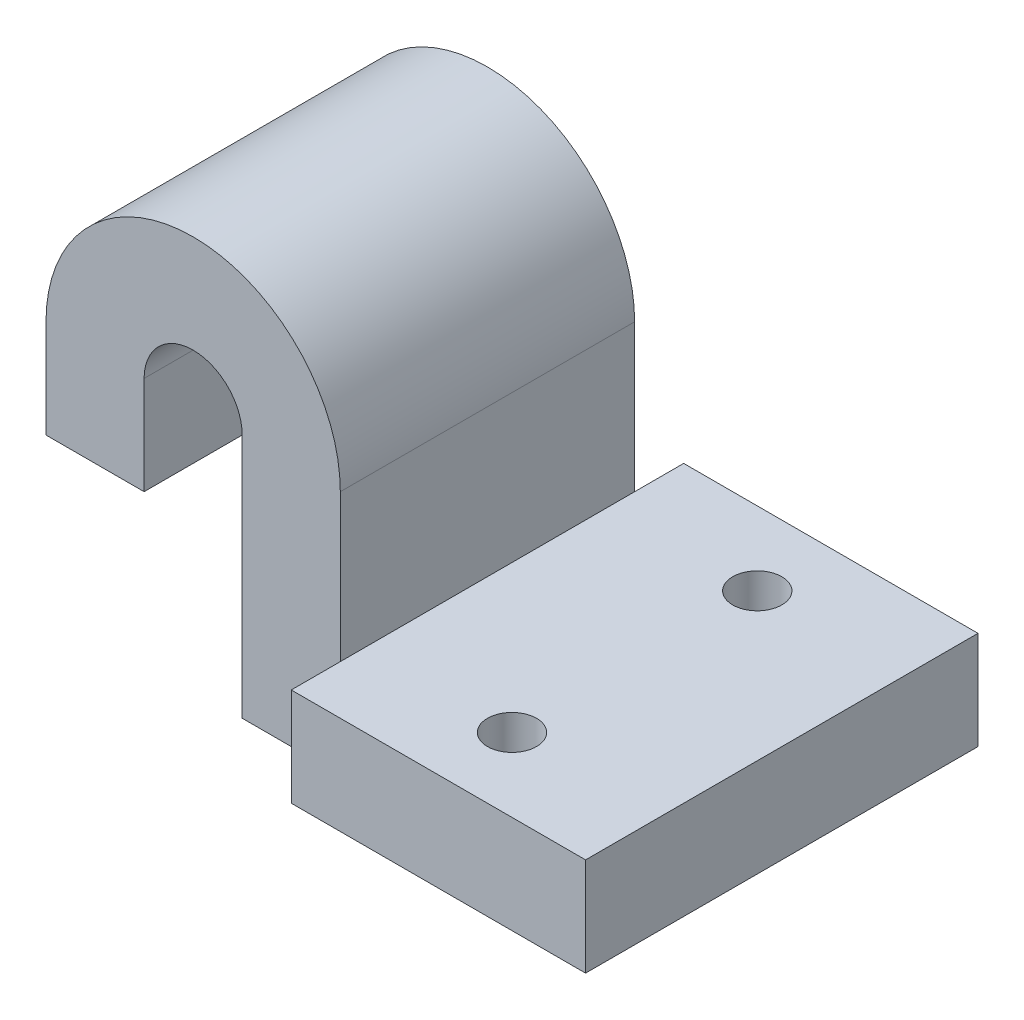
ISO-10303-21;
HEADER;
FILE_DESCRIPTION(('STEP AP214'),'2;1');
FILE_NAME('part.step','',(''),(''),'','','');
FILE_SCHEMA(('AUTOMOTIVE_DESIGN { 1 0 10303 214 1 1 1 1 }'));
ENDSEC;
DATA;
#1=APPLICATION_CONTEXT('core data for automotive mechanical design processes');
#2=APPLICATION_PROTOCOL_DEFINITION('international standard','automotive_design',2000,#1);
#3=PRODUCT_CONTEXT('',#1,'mechanical');
#4=PRODUCT('Part','Part','',(#3));
#5=PRODUCT_RELATED_PRODUCT_CATEGORY('part','',(#4));
#6=PRODUCT_DEFINITION_FORMATION('','',#4);
#7=PRODUCT_DEFINITION_CONTEXT('part definition',#1,'design');
#8=PRODUCT_DEFINITION('design','',#6,#7);
#9=PRODUCT_DEFINITION_SHAPE('','',#8);
#10=(LENGTH_UNIT() NAMED_UNIT(*) SI_UNIT(.MILLI.,.METRE.));
#11=(NAMED_UNIT(*) PLANE_ANGLE_UNIT() SI_UNIT($,.RADIAN.));
#12=(NAMED_UNIT(*) SI_UNIT($,.STERADIAN.) SOLID_ANGLE_UNIT());
#13=UNCERTAINTY_MEASURE_WITH_UNIT(LENGTH_MEASURE(1.E-05),#10,'distance_accuracy_value','');
#14=(GEOMETRIC_REPRESENTATION_CONTEXT(3) GLOBAL_UNCERTAINTY_ASSIGNED_CONTEXT((#13)) GLOBAL_UNIT_ASSIGNED_CONTEXT((#10,
#11,#12)) REPRESENTATION_CONTEXT('',''));
#15=CARTESIAN_POINT('',(0.,0.,0.));
#16=DIRECTION('',(0.,0.,1.));
#17=DIRECTION('',(1.,0.,0.));
#18=AXIS2_PLACEMENT_3D('',#15,#16,#17);
#19=CARTESIAN_POINT('',(-19.05,12.7,0.));
#20=DIRECTION('',(1.,0.,0.));
#21=DIRECTION('',(0.,0.,-1.));
#22=AXIS2_PLACEMENT_3D('',#19,#20,#21);
#23=PLANE('',#22);
#24=DIRECTION('',(0.,1.,0.));
#25=VECTOR('',#24,1.);
#26=CARTESIAN_POINT('',(-19.05,0.,-3.17499999999999));
#27=LINE('',#26,#25);
#28=CARTESIAN_POINT('',(-19.05,0.,-3.17499999999999));
#29=VERTEX_POINT('',#28);
#30=CARTESIAN_POINT('',(-19.05,12.7,-3.17499999999999));
#31=VERTEX_POINT('',#30);
#32=EDGE_CURVE('E69',#29,#31,#27,.T.);
#33=ORIENTED_EDGE('',*,*,#32,.T.);
#34=DIRECTION('',(0.,0.,1.));
#35=VECTOR('',#34,1.);
#36=CARTESIAN_POINT('',(-19.05,12.7,0.));
#37=LINE('',#36,#35);
#38=CARTESIAN_POINT('',(-19.05,12.7,-9.525));
#39=VERTEX_POINT('',#38);
#40=EDGE_CURVE('E256',#39,#31,#37,.T.);
#41=ORIENTED_EDGE('',*,*,#40,.F.);
#42=DIRECTION('',(0.,-1.,0.));
#43=VECTOR('',#42,1.);
#44=CARTESIAN_POINT('',(-19.05,12.7,-9.525));
#45=LINE('',#44,#43);
#46=CARTESIAN_POINT('',(-19.05,0.,-9.525));
#47=VERTEX_POINT('',#46);
#48=EDGE_CURVE('E54',#39,#47,#45,.T.);
#49=ORIENTED_EDGE('',*,*,#48,.T.);
#50=DIRECTION('',(0.,0.,1.));
#51=VECTOR('',#50,1.);
#52=CARTESIAN_POINT('',(-19.05,0.,0.));
#53=LINE('',#52,#51);
#54=EDGE_CURVE('E279',#47,#29,#53,.T.);
#55=ORIENTED_EDGE('',*,*,#54,.T.);
#56=EDGE_LOOP('',(#33,#41,#49,#55));
#57=FACE_BOUND('',#56,.T.);
#58=ADVANCED_FACE('F45',(#57),#23,.F.);
#59=CARTESIAN_POINT('',(19.05,12.7,0.));
#60=DIRECTION('',(1.,0.,0.));
#61=DIRECTION('',(0.,0.,-1.));
#62=AXIS2_PLACEMENT_3D('',#59,#60,#61);
#63=PLANE('',#62);
#64=DIRECTION('',(0.,0.,1.));
#65=VECTOR('',#64,1.);
#66=CARTESIAN_POINT('',(19.05,0.,0.));
#67=LINE('',#66,#65);
#68=CARTESIAN_POINT('',(19.05,0.,-9.525));
#69=VERTEX_POINT('',#68);
#70=CARTESIAN_POINT('',(19.05,0.,41.275));
#71=VERTEX_POINT('',#70);
#72=EDGE_CURVE('E270',#69,#71,#67,.T.);
#73=ORIENTED_EDGE('',*,*,#72,.F.);
#74=DIRECTION('',(0.,-1.,0.));
#75=VECTOR('',#74,1.);
#76=CARTESIAN_POINT('',(19.05,12.7,-9.525));
#77=LINE('',#76,#75);
#78=CARTESIAN_POINT('',(19.05,12.7,-9.525));
#79=VERTEX_POINT('',#78);
#80=EDGE_CURVE('E11',#79,#69,#77,.T.);
#81=ORIENTED_EDGE('',*,*,#80,.F.);
#82=DIRECTION('',(0.,0.,1.));
#83=VECTOR('',#82,1.);
#84=CARTESIAN_POINT('',(19.05,12.7,0.));
#85=LINE('',#84,#83);
#86=CARTESIAN_POINT('',(19.05,12.7,41.275));
#87=VERTEX_POINT('',#86);
#88=EDGE_CURVE('E247',#79,#87,#85,.T.);
#89=ORIENTED_EDGE('',*,*,#88,.T.);
#90=DIRECTION('',(0.,-1.,0.));
#91=VECTOR('',#90,1.);
#92=CARTESIAN_POINT('',(19.05,12.7,41.275));
#93=LINE('',#92,#91);
#94=EDGE_CURVE('E266',#87,#71,#93,.T.);
#95=ORIENTED_EDGE('',*,*,#94,.T.);
#96=EDGE_LOOP('',(#73,#81,#89,#95));
#97=FACE_BOUND('',#96,.T.);
#98=ADVANCED_FACE('F306',(#97),#63,.T.);
#99=CARTESIAN_POINT('',(0.,12.7,-9.525));
#100=DIRECTION('',(0.,0.,-1.));
#101=DIRECTION('',(-1.,0.,0.));
#102=AXIS2_PLACEMENT_3D('',#99,#100,#101);
#103=PLANE('',#102);
#104=DIRECTION('',(1.,0.,0.));
#105=VECTOR('',#104,1.);
#106=CARTESIAN_POINT('',(0.,0.,-9.525));
#107=LINE('',#106,#105);
#108=EDGE_CURVE('E274',#47,#69,#107,.T.);
#109=ORIENTED_EDGE('',*,*,#108,.F.);
#110=ORIENTED_EDGE('',*,*,#48,.F.);
#111=DIRECTION('',(1.,0.,0.));
#112=VECTOR('',#111,1.);
#113=CARTESIAN_POINT('',(0.,12.7,-9.525));
#114=LINE('',#113,#112);
#115=EDGE_CURVE('E252',#39,#79,#114,.T.);
#116=ORIENTED_EDGE('',*,*,#115,.T.);
#117=ORIENTED_EDGE('',*,*,#80,.T.);
#118=EDGE_LOOP('',(#109,#110,#116,#117));
#119=FACE_BOUND('',#118,.T.);
#120=ADVANCED_FACE('F302',(#119),#103,.T.);
#121=CARTESIAN_POINT('',(-19.05,12.7,34.925));
#122=VERTEX_POINT('',#121);
#123=CARTESIAN_POINT('',(-19.05,12.7,41.275));
#124=VERTEX_POINT('',#123);
#125=EDGE_CURVE('E61',#122,#124,#37,.T.);
#126=ORIENTED_EDGE('',*,*,#125,.F.);
#127=DIRECTION('',(0.,1.,0.));
#128=VECTOR('',#127,1.);
#129=CARTESIAN_POINT('',(-19.05,0.,34.925));
#130=LINE('',#129,#128);
#131=CARTESIAN_POINT('',(-19.05,0.,34.925));
#132=VERTEX_POINT('',#131);
#133=EDGE_CURVE('E206',#132,#122,#130,.T.);
#134=ORIENTED_EDGE('',*,*,#133,.F.);
#135=CARTESIAN_POINT('',(-19.05,0.,41.275));
#136=VERTEX_POINT('',#135);
#137=EDGE_CURVE('E278',#132,#136,#53,.T.);
#138=ORIENTED_EDGE('',*,*,#137,.T.);
#139=DIRECTION('',(0.,-1.,0.));
#140=VECTOR('',#139,1.);
#141=CARTESIAN_POINT('',(-19.05,12.7,41.275));
#142=LINE('',#141,#140);
#143=EDGE_CURVE('E291',#124,#136,#142,.T.);
#144=ORIENTED_EDGE('',*,*,#143,.F.);
#145=EDGE_LOOP('',(#126,#134,#138,#144));
#146=FACE_BOUND('',#145,.T.);
#147=ADVANCED_FACE('F312',(#146),#23,.F.);
#148=CARTESIAN_POINT('',(0.,12.7,41.275));
#149=DIRECTION('',(0.,0.,-1.));
#150=DIRECTION('',(-1.,0.,0.));
#151=AXIS2_PLACEMENT_3D('',#148,#149,#150);
#152=PLANE('',#151);
#153=DIRECTION('',(1.,0.,0.));
#154=VECTOR('',#153,1.);
#155=CARTESIAN_POINT('',(0.,0.,41.275));
#156=LINE('',#155,#154);
#157=EDGE_CURVE('E282',#136,#71,#156,.T.);
#158=ORIENTED_EDGE('',*,*,#157,.T.);
#159=ORIENTED_EDGE('',*,*,#94,.F.);
#160=DIRECTION('',(1.,0.,0.));
#161=VECTOR('',#160,1.);
#162=CARTESIAN_POINT('',(0.,12.7,41.275));
#163=LINE('',#162,#161);
#164=EDGE_CURVE('E259',#124,#87,#163,.T.);
#165=ORIENTED_EDGE('',*,*,#164,.F.);
#166=ORIENTED_EDGE('',*,*,#143,.T.);
#167=EDGE_LOOP('',(#158,#159,#165,#166));
#168=FACE_BOUND('',#167,.T.);
#169=ADVANCED_FACE('F311',(#168),#152,.F.);
#170=CARTESIAN_POINT('',(0.,12.7,0.));
#171=DIRECTION('',(0.,-1.,0.));
#172=DIRECTION('',(0.,0.,-1.));
#173=AXIS2_PLACEMENT_3D('',#170,#171,#172);
#174=CYLINDRICAL_SURFACE('',#173,3.175);
#175=CARTESIAN_POINT('',(0.,12.7,0.));
#176=DIRECTION('',(0.,1.,0.));
#177=DIRECTION('',(0.,0.,1.));
#178=AXIS2_PLACEMENT_3D('',#175,#176,#177);
#179=CIRCLE('',#178,3.175);
#180=CARTESIAN_POINT('',(0.,12.7,3.175));
#181=VERTEX_POINT('',#180);
#182=EDGE_CURVE('E243',#181,#181,#179,.T.);
#183=ORIENTED_EDGE('',*,*,#182,.T.);
#184=EDGE_LOOP('',(#183));
#185=FACE_BOUND('',#184,.T.);
#186=CARTESIAN_POINT('',(0.,0.,0.));
#187=DIRECTION('',(0.,1.,0.));
#188=DIRECTION('',(0.,0.,1.));
#189=AXIS2_PLACEMENT_3D('',#186,#187,#188);
#190=CIRCLE('',#189,3.175);
#191=CARTESIAN_POINT('',(0.,0.,3.175));
#192=VERTEX_POINT('',#191);
#193=EDGE_CURVE('E242',#192,#192,#190,.T.);
#194=ORIENTED_EDGE('',*,*,#193,.F.);
#195=EDGE_LOOP('',(#194));
#196=FACE_BOUND('',#195,.T.);
#197=ADVANCED_FACE('F47',(#185,#196),#174,.F.);
#198=CARTESIAN_POINT('',(0.,12.7,31.75));
#199=DIRECTION('',(0.,-1.,0.));
#200=DIRECTION('',(0.,0.,-1.));
#201=AXIS2_PLACEMENT_3D('',#198,#199,#200);
#202=CYLINDRICAL_SURFACE('',#201,3.175);
#203=CARTESIAN_POINT('',(0.,12.7,31.75));
#204=DIRECTION('',(0.,1.,0.));
#205=DIRECTION('',(0.,0.,1.));
#206=AXIS2_PLACEMENT_3D('',#203,#204,#205);
#207=CIRCLE('',#206,3.175);
#208=CARTESIAN_POINT('',(0.,12.7,34.925));
#209=VERTEX_POINT('',#208);
#210=EDGE_CURVE('E262',#209,#209,#207,.F.);
#211=ORIENTED_EDGE('',*,*,#210,.F.);
#212=EDGE_LOOP('',(#211));
#213=FACE_BOUND('',#212,.T.);
#214=CARTESIAN_POINT('',(0.,0.,31.75));
#215=DIRECTION('',(0.,1.,0.));
#216=DIRECTION('',(0.,0.,1.));
#217=AXIS2_PLACEMENT_3D('',#214,#215,#216);
#218=CIRCLE('',#217,3.175);
#219=CARTESIAN_POINT('',(0.,0.,34.925));
#220=VERTEX_POINT('',#219);
#221=EDGE_CURVE('E248',#220,#220,#218,.F.);
#222=ORIENTED_EDGE('',*,*,#221,.T.);
#223=EDGE_LOOP('',(#222));
#224=FACE_BOUND('',#223,.T.);
#225=ADVANCED_FACE('F377',(#213,#224),#202,.F.);
#226=CARTESIAN_POINT('',(0.,12.7,0.));
#227=DIRECTION('',(0.,1.,0.));
#228=DIRECTION('',(0.,0.,1.));
#229=AXIS2_PLACEMENT_3D('',#226,#227,#228);
#230=PLANE('',#229);
#231=ORIENTED_EDGE('',*,*,#182,.F.);
#232=EDGE_LOOP('',(#231));
#233=FACE_BOUND('',#232,.T.);
#234=ORIENTED_EDGE('',*,*,#88,.F.);
#235=ORIENTED_EDGE('',*,*,#115,.F.);
#236=ORIENTED_EDGE('',*,*,#40,.T.);
#237=DIRECTION('',(0.,0.,-1.));
#238=VECTOR('',#237,1.);
#239=CARTESIAN_POINT('',(-19.05,12.7,0.));
#240=LINE('',#239,#238);
#241=EDGE_CURVE('E223',#122,#31,#240,.T.);
#242=ORIENTED_EDGE('',*,*,#241,.F.);
#243=ORIENTED_EDGE('',*,*,#125,.T.);
#244=ORIENTED_EDGE('',*,*,#164,.T.);
#245=EDGE_LOOP('',(#234,#235,#236,#242,#243,#244));
#246=FACE_BOUND('',#245,.T.);
#247=ORIENTED_EDGE('',*,*,#210,.T.);
#248=EDGE_LOOP('',(#247));
#249=FACE_BOUND('',#248,.T.);
#250=ADVANCED_FACE('F384',(#233,#246,#249),#230,.T.);
#251=CARTESIAN_POINT('',(0.,0.,0.));
#252=DIRECTION('',(0.,1.,0.));
#253=DIRECTION('',(0.,0.,1.));
#254=AXIS2_PLACEMENT_3D('',#251,#252,#253);
#255=PLANE('',#254);
#256=ORIENTED_EDGE('',*,*,#193,.T.);
#257=EDGE_LOOP('',(#256));
#258=FACE_BOUND('',#257,.T.);
#259=ORIENTED_EDGE('',*,*,#72,.T.);
#260=ORIENTED_EDGE('',*,*,#157,.F.);
#261=ORIENTED_EDGE('',*,*,#137,.F.);
#262=DIRECTION('',(-1.,0.,0.));
#263=VECTOR('',#262,1.);
#264=CARTESIAN_POINT('',(0.,0.,34.925));
#265=LINE('',#264,#263);
#266=CARTESIAN_POINT('',(-31.75,0.,34.925));
#267=VERTEX_POINT('',#266);
#268=EDGE_CURVE('E202',#132,#267,#265,.T.);
#269=ORIENTED_EDGE('',*,*,#268,.T.);
#270=DIRECTION('',(0.,0.,1.));
#271=VECTOR('',#270,1.);
#272=CARTESIAN_POINT('',(-31.75,0.,-3.17499999999999));
#273=LINE('',#272,#271);
#274=CARTESIAN_POINT('',(-31.75,0.,-3.17499999999999));
#275=VERTEX_POINT('',#274);
#276=EDGE_CURVE('E164',#275,#267,#273,.T.);
#277=ORIENTED_EDGE('',*,*,#276,.F.);
#278=DIRECTION('',(-1.,0.,0.));
#279=VECTOR('',#278,1.);
#280=CARTESIAN_POINT('',(0.,0.,-3.17499999999999));
#281=LINE('',#280,#279);
#282=EDGE_CURVE('E149',#29,#275,#281,.T.);
#283=ORIENTED_EDGE('',*,*,#282,.F.);
#284=ORIENTED_EDGE('',*,*,#54,.F.);
#285=ORIENTED_EDGE('',*,*,#108,.T.);
#286=EDGE_LOOP('',(#259,#260,#261,#269,#277,#283,#284,#285));
#287=FACE_BOUND('',#286,.T.);
#288=ORIENTED_EDGE('',*,*,#221,.F.);
#289=EDGE_LOOP('',(#288));
#290=FACE_BOUND('',#289,.T.);
#291=ADVANCED_FACE('F300',(#258,#287,#290),#255,.F.);
#292=CARTESIAN_POINT('',(-38.1,31.75,-3.17499999999999));
#293=DIRECTION('',(0.,0.,1.));
#294=DIRECTION('',(1.,0.,0.));
#295=AXIS2_PLACEMENT_3D('',#292,#293,#294);
#296=CYLINDRICAL_SURFACE('',#295,6.35000000000001);
#297=CARTESIAN_POINT('',(-38.1,31.75,34.925));
#298=DIRECTION('',(0.,0.,1.));
#299=DIRECTION('',(1.,0.,0.));
#300=AXIS2_PLACEMENT_3D('',#297,#298,#299);
#301=CIRCLE('',#300,6.35000000000001);
#302=CARTESIAN_POINT('',(-31.75,31.75,34.925));
#303=VERTEX_POINT('',#302);
#304=CARTESIAN_POINT('',(-44.45,31.75,34.925));
#305=VERTEX_POINT('',#304);
#306=EDGE_CURVE('E197',#303,#305,#301,.T.);
#307=ORIENTED_EDGE('',*,*,#306,.T.);
#308=DIRECTION('',(0.,0.,1.));
#309=VECTOR('',#308,1.);
#310=CARTESIAN_POINT('',(-44.45,31.75,-3.17499999999999));
#311=LINE('',#310,#309);
#312=CARTESIAN_POINT('',(-44.45,31.75,-3.17499999999999));
#313=VERTEX_POINT('',#312);
#314=EDGE_CURVE('E169',#313,#305,#311,.T.);
#315=ORIENTED_EDGE('',*,*,#314,.F.);
#316=CARTESIAN_POINT('',(-38.1,31.75,-3.17499999999999));
#317=DIRECTION('',(0.,0.,1.));
#318=DIRECTION('',(1.,0.,0.));
#319=AXIS2_PLACEMENT_3D('',#316,#317,#318);
#320=CIRCLE('',#319,6.35000000000001);
#321=CARTESIAN_POINT('',(-31.75,31.75,-3.17499999999999));
#322=VERTEX_POINT('',#321);
#323=EDGE_CURVE('E146',#322,#313,#320,.T.);
#324=ORIENTED_EDGE('',*,*,#323,.F.);
#325=DIRECTION('',(0.,0.,1.));
#326=VECTOR('',#325,1.);
#327=CARTESIAN_POINT('',(-31.75,31.75,-3.17499999999999));
#328=LINE('',#327,#326);
#329=EDGE_CURVE('E156',#322,#303,#328,.T.);
#330=ORIENTED_EDGE('',*,*,#329,.T.);
#331=EDGE_LOOP('',(#307,#315,#324,#330));
#332=FACE_BOUND('',#331,.T.);
#333=ADVANCED_FACE('F167',(#332),#296,.F.);
#334=CARTESIAN_POINT('',(-44.45,0.,-3.17499999999999));
#335=DIRECTION('',(-1.,0.,0.));
#336=DIRECTION('',(0.,0.,1.));
#337=AXIS2_PLACEMENT_3D('',#334,#335,#336);
#338=PLANE('',#337);
#339=DIRECTION('',(0.,-1.,0.));
#340=VECTOR('',#339,1.);
#341=CARTESIAN_POINT('',(-44.45,0.,34.925));
#342=LINE('',#341,#340);
#343=CARTESIAN_POINT('',(-44.45,19.05,34.925));
#344=VERTEX_POINT('',#343);
#345=EDGE_CURVE('E171',#305,#344,#342,.T.);
#346=ORIENTED_EDGE('',*,*,#345,.T.);
#347=DIRECTION('',(0.,0.,1.));
#348=VECTOR('',#347,1.);
#349=CARTESIAN_POINT('',(-44.45,19.05,-3.17499999999999));
#350=LINE('',#349,#348);
#351=CARTESIAN_POINT('',(-44.45,19.05,-3.17499999999999));
#352=VERTEX_POINT('',#351);
#353=EDGE_CURVE('E224',#352,#344,#350,.T.);
#354=ORIENTED_EDGE('',*,*,#353,.F.);
#355=DIRECTION('',(0.,-1.,0.));
#356=VECTOR('',#355,1.);
#357=CARTESIAN_POINT('',(-44.45,0.,-3.17499999999999));
#358=LINE('',#357,#356);
#359=EDGE_CURVE('E165',#313,#352,#358,.T.);
#360=ORIENTED_EDGE('',*,*,#359,.F.);
#361=ORIENTED_EDGE('',*,*,#314,.T.);
#362=EDGE_LOOP('',(#346,#354,#360,#361));
#363=FACE_BOUND('',#362,.T.);
#364=ADVANCED_FACE('F336',(#363),#338,.F.);
#365=CARTESIAN_POINT('',(0.,19.05,-3.17499999999999));
#366=DIRECTION('',(0.,-1.,0.));
#367=DIRECTION('',(0.,0.,-1.));
#368=AXIS2_PLACEMENT_3D('',#365,#366,#367);
#369=PLANE('',#368);
#370=DIRECTION('',(1.,0.,0.));
#371=VECTOR('',#370,1.);
#372=CARTESIAN_POINT('',(0.,19.05,34.925));
#373=LINE('',#372,#371);
#374=CARTESIAN_POINT('',(-57.15,19.05,34.925));
#375=VERTEX_POINT('',#374);
#376=EDGE_CURVE('E175',#375,#344,#373,.T.);
#377=ORIENTED_EDGE('',*,*,#376,.F.);
#378=DIRECTION('',(0.,0.,1.));
#379=VECTOR('',#378,1.);
#380=CARTESIAN_POINT('',(-57.15,19.05,-3.17499999999999));
#381=LINE('',#380,#379);
#382=CARTESIAN_POINT('',(-57.15,19.05,-3.17499999999999));
#383=VERTEX_POINT('',#382);
#384=EDGE_CURVE('E227',#383,#375,#381,.T.);
#385=ORIENTED_EDGE('',*,*,#384,.F.);
#386=DIRECTION('',(1.,0.,0.));
#387=VECTOR('',#386,1.);
#388=CARTESIAN_POINT('',(0.,19.05,-3.17499999999999));
#389=LINE('',#388,#387);
#390=EDGE_CURVE('E191',#383,#352,#389,.T.);
#391=ORIENTED_EDGE('',*,*,#390,.T.);
#392=ORIENTED_EDGE('',*,*,#353,.T.);
#393=EDGE_LOOP('',(#377,#385,#391,#392));
#394=FACE_BOUND('',#393,.T.);
#395=ADVANCED_FACE('F338',(#394),#369,.T.);
#396=CARTESIAN_POINT('',(-57.15,0.,-3.17499999999999));
#397=DIRECTION('',(-1.,0.,0.));
#398=DIRECTION('',(0.,0.,1.));
#399=AXIS2_PLACEMENT_3D('',#396,#397,#398);
#400=PLANE('',#399);
#401=DIRECTION('',(0.,-1.,0.));
#402=VECTOR('',#401,1.);
#403=CARTESIAN_POINT('',(-57.15,0.,34.925));
#404=LINE('',#403,#402);
#405=CARTESIAN_POINT('',(-57.15,31.75,34.925));
#406=VERTEX_POINT('',#405);
#407=EDGE_CURVE('E214',#406,#375,#404,.T.);
#408=ORIENTED_EDGE('',*,*,#407,.F.);
#409=DIRECTION('',(0.,0.,1.));
#410=VECTOR('',#409,1.);
#411=CARTESIAN_POINT('',(-57.15,31.75,-3.17499999999999));
#412=LINE('',#411,#410);
#413=CARTESIAN_POINT('',(-57.15,31.75,-3.17499999999999));
#414=VERTEX_POINT('',#413);
#415=EDGE_CURVE('E230',#414,#406,#412,.T.);
#416=ORIENTED_EDGE('',*,*,#415,.F.);
#417=DIRECTION('',(0.,-1.,0.));
#418=VECTOR('',#417,1.);
#419=CARTESIAN_POINT('',(-57.15,0.,-3.17499999999999));
#420=LINE('',#419,#418);
#421=EDGE_CURVE('E187',#414,#383,#420,.T.);
#422=ORIENTED_EDGE('',*,*,#421,.T.);
#423=ORIENTED_EDGE('',*,*,#384,.T.);
#424=EDGE_LOOP('',(#408,#416,#422,#423));
#425=FACE_BOUND('',#424,.T.);
#426=ADVANCED_FACE('F329',(#425),#400,.T.);
#427=CARTESIAN_POINT('',(-38.1,31.75,-3.17499999999999));
#428=DIRECTION('',(0.,0.,1.));
#429=DIRECTION('',(1.,0.,0.));
#430=AXIS2_PLACEMENT_3D('',#427,#428,#429);
#431=CYLINDRICAL_SURFACE('',#430,19.05);
#432=CARTESIAN_POINT('',(-38.1,31.75,34.925));
#433=DIRECTION('',(0.,0.,1.));
#434=DIRECTION('',(1.,0.,0.));
#435=AXIS2_PLACEMENT_3D('',#432,#433,#434);
#436=CIRCLE('',#435,19.05);
#437=CARTESIAN_POINT('',(-19.05,31.75,34.925));
#438=VERTEX_POINT('',#437);
#439=EDGE_CURVE('E210',#438,#406,#436,.T.);
#440=ORIENTED_EDGE('',*,*,#439,.F.);
#441=DIRECTION('',(0.,0.,1.));
#442=VECTOR('',#441,1.);
#443=CARTESIAN_POINT('',(-19.05,31.75,-3.17499999999999));
#444=LINE('',#443,#442);
#445=CARTESIAN_POINT('',(-19.05,31.75,-3.17499999999999));
#446=VERTEX_POINT('',#445);
#447=EDGE_CURVE('E233',#446,#438,#444,.T.);
#448=ORIENTED_EDGE('',*,*,#447,.F.);
#449=CARTESIAN_POINT('',(-38.1,31.75,-3.17499999999999));
#450=DIRECTION('',(0.,0.,1.));
#451=DIRECTION('',(1.,0.,0.));
#452=AXIS2_PLACEMENT_3D('',#449,#450,#451);
#453=CIRCLE('',#452,19.05);
#454=EDGE_CURVE('E183',#446,#414,#453,.T.);
#455=ORIENTED_EDGE('',*,*,#454,.T.);
#456=ORIENTED_EDGE('',*,*,#415,.T.);
#457=EDGE_LOOP('',(#440,#448,#455,#456));
#458=FACE_BOUND('',#457,.T.);
#459=ADVANCED_FACE('F324',(#458),#431,.T.);
#460=CARTESIAN_POINT('',(-19.05,0.,-3.17499999999999));
#461=DIRECTION('',(1.,0.,0.));
#462=DIRECTION('',(0.,0.,-1.));
#463=AXIS2_PLACEMENT_3D('',#460,#461,#462);
#464=PLANE('',#463);
#465=EDGE_CURVE('E205',#122,#438,#130,.T.);
#466=ORIENTED_EDGE('',*,*,#465,.F.);
#467=ORIENTED_EDGE('',*,*,#241,.T.);
#468=EDGE_CURVE('E180',#31,#446,#27,.T.);
#469=ORIENTED_EDGE('',*,*,#468,.T.);
#470=ORIENTED_EDGE('',*,*,#447,.T.);
#471=EDGE_LOOP('',(#466,#467,#469,#470));
#472=FACE_BOUND('',#471,.T.);
#473=ADVANCED_FACE('F320',(#472),#464,.T.);
#474=CARTESIAN_POINT('',(-31.75,0.,-3.17499999999999));
#475=DIRECTION('',(1.,0.,0.));
#476=DIRECTION('',(0.,0.,-1.));
#477=AXIS2_PLACEMENT_3D('',#474,#475,#476);
#478=PLANE('',#477);
#479=DIRECTION('',(0.,1.,0.));
#480=VECTOR('',#479,1.);
#481=CARTESIAN_POINT('',(-31.75,0.,34.925));
#482=LINE('',#481,#480);
#483=EDGE_CURVE('E159',#267,#303,#482,.T.);
#484=ORIENTED_EDGE('',*,*,#483,.T.);
#485=ORIENTED_EDGE('',*,*,#329,.F.);
#486=DIRECTION('',(0.,1.,0.));
#487=VECTOR('',#486,1.);
#488=CARTESIAN_POINT('',(-31.75,0.,-3.17499999999999));
#489=LINE('',#488,#487);
#490=EDGE_CURVE('E142',#275,#322,#489,.T.);
#491=ORIENTED_EDGE('',*,*,#490,.F.);
#492=ORIENTED_EDGE('',*,*,#276,.T.);
#493=EDGE_LOOP('',(#484,#485,#491,#492));
#494=FACE_BOUND('',#493,.T.);
#495=ADVANCED_FACE('F157',(#494),#478,.F.);
#496=CARTESIAN_POINT('',(0.,0.,-3.17499999999999));
#497=DIRECTION('',(0.,0.,1.));
#498=DIRECTION('',(1.,0.,0.));
#499=AXIS2_PLACEMENT_3D('',#496,#497,#498);
#500=PLANE('',#499);
#501=ORIENTED_EDGE('',*,*,#323,.T.);
#502=ORIENTED_EDGE('',*,*,#359,.T.);
#503=ORIENTED_EDGE('',*,*,#390,.F.);
#504=ORIENTED_EDGE('',*,*,#421,.F.);
#505=ORIENTED_EDGE('',*,*,#454,.F.);
#506=ORIENTED_EDGE('',*,*,#468,.F.);
#507=ORIENTED_EDGE('',*,*,#32,.F.);
#508=ORIENTED_EDGE('',*,*,#282,.T.);
#509=ORIENTED_EDGE('',*,*,#490,.T.);
#510=EDGE_LOOP('',(#501,#502,#503,#504,#505,#506,#507,#508,#509));
#511=FACE_BOUND('',#510,.T.);
#512=ADVANCED_FACE('F144',(#511),#500,.F.);
#513=CARTESIAN_POINT('',(0.,0.,34.925));
#514=DIRECTION('',(0.,0.,1.));
#515=DIRECTION('',(1.,0.,0.));
#516=AXIS2_PLACEMENT_3D('',#513,#514,#515);
#517=PLANE('',#516);
#518=ORIENTED_EDGE('',*,*,#306,.F.);
#519=ORIENTED_EDGE('',*,*,#483,.F.);
#520=ORIENTED_EDGE('',*,*,#268,.F.);
#521=ORIENTED_EDGE('',*,*,#133,.T.);
#522=ORIENTED_EDGE('',*,*,#465,.T.);
#523=ORIENTED_EDGE('',*,*,#439,.T.);
#524=ORIENTED_EDGE('',*,*,#407,.T.);
#525=ORIENTED_EDGE('',*,*,#376,.T.);
#526=ORIENTED_EDGE('',*,*,#345,.F.);
#527=EDGE_LOOP('',(#518,#519,#520,#521,#522,#523,#524,#525,#526));
#528=FACE_BOUND('',#527,.T.);
#529=ADVANCED_FACE('F332',(#528),#517,.T.);
#530=CLOSED_SHELL('',(#58,#98,#120,#147,#169,#197,#225,#250,#291,#333,#364,#395,#426,#459,#473,
#495,#512,#529));
#531=MANIFOLD_SOLID_BREP('B2',#530);
#532=ADVANCED_BREP_SHAPE_REPRESENTATION('',(#18,#531),#14);
#533=SHAPE_DEFINITION_REPRESENTATION(#9,#532);
ENDSEC;
END-ISO-10303-21;
